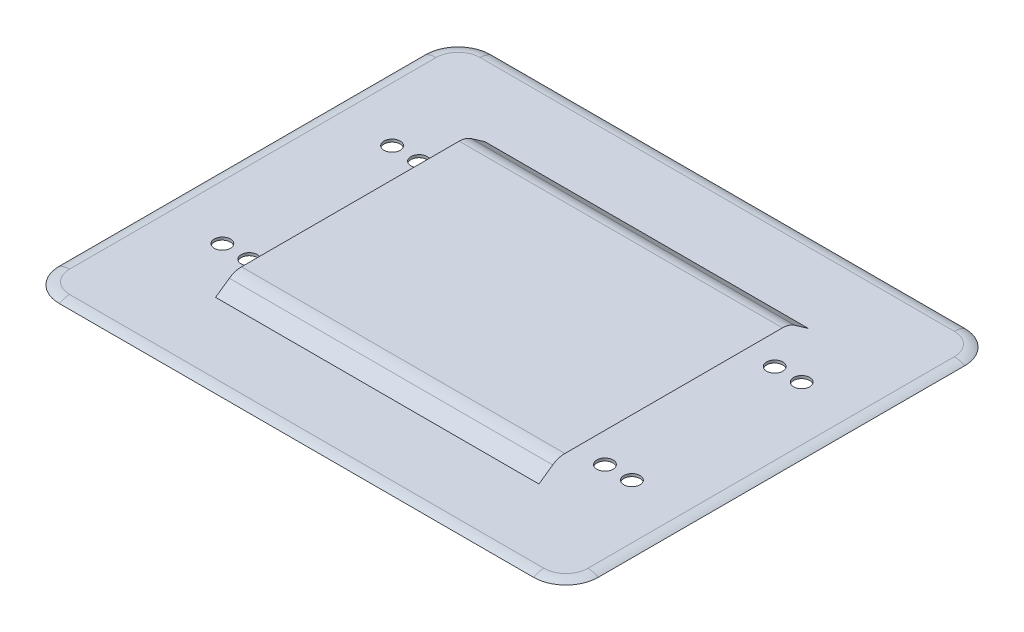
ISO-10303-21;
HEADER;
FILE_DESCRIPTION(('STEP AP214'),'2;1');
FILE_NAME('part.step','',(''),(''),'','','');
FILE_SCHEMA(('AUTOMOTIVE_DESIGN { 1 0 10303 214 1 1 1 1 }'));
ENDSEC;
DATA;
#1=APPLICATION_CONTEXT('core data for automotive mechanical design processes');
#2=APPLICATION_PROTOCOL_DEFINITION('international standard','automotive_design',2000,#1);
#3=PRODUCT_CONTEXT('',#1,'mechanical');
#4=PRODUCT('Part','Part','',(#3));
#5=PRODUCT_RELATED_PRODUCT_CATEGORY('part','',(#4));
#6=PRODUCT_DEFINITION_FORMATION('','',#4);
#7=PRODUCT_DEFINITION_CONTEXT('part definition',#1,'design');
#8=PRODUCT_DEFINITION('design','',#6,#7);
#9=PRODUCT_DEFINITION_SHAPE('','',#8);
#10=(LENGTH_UNIT() NAMED_UNIT(*) SI_UNIT(.MILLI.,.METRE.));
#11=(NAMED_UNIT(*) PLANE_ANGLE_UNIT() SI_UNIT($,.RADIAN.));
#12=(NAMED_UNIT(*) SI_UNIT($,.STERADIAN.) SOLID_ANGLE_UNIT());
#13=UNCERTAINTY_MEASURE_WITH_UNIT(LENGTH_MEASURE(1.E-05),#10,'distance_accuracy_value','');
#14=(GEOMETRIC_REPRESENTATION_CONTEXT(3) GLOBAL_UNCERTAINTY_ASSIGNED_CONTEXT((#13)) GLOBAL_UNIT_ASSIGNED_CONTEXT((#10,
#11,#12)) REPRESENTATION_CONTEXT('',''));
#15=CARTESIAN_POINT('',(0.,0.,0.));
#16=DIRECTION('',(0.,0.,1.));
#17=DIRECTION('',(1.,0.,0.));
#18=AXIS2_PLACEMENT_3D('',#15,#16,#17);
#19=CARTESIAN_POINT('',(76.2,1.27,63.5));
#20=DIRECTION('',(0.,0.819152044288991,0.573576436351047));
#21=DIRECTION('',(0.,-0.573576436351047,0.819152044288991));
#22=AXIS2_PLACEMENT_3D('',#19,#20,#21);
#23=PLANE('',#22);
#24=DIRECTION('',(0.,0.573576436351047,-0.819152044288991));
#25=VECTOR('',#24,1.);
#26=CARTESIAN_POINT('',(76.2,1.27,63.5));
#27=LINE('',#26,#25);
#28=CARTESIAN_POINT('',(76.2,1.27,63.5));
#29=VERTEX_POINT('',#28);
#30=CARTESIAN_POINT('',(76.2,5.81152044288991,57.0140366319082));
#31=VERTEX_POINT('',#30);
#32=EDGE_CURVE('E107',#29,#31,#27,.T.);
#33=ORIENTED_EDGE('',*,*,#32,.T.);
#34=DIRECTION('',(-1.,0.,0.));
#35=VECTOR('',#34,1.);
#36=CARTESIAN_POINT('',(76.2,5.81152044288991,57.0140366319082));
#37=LINE('',#36,#35);
#38=CARTESIAN_POINT('',(-76.2,5.81152044288991,57.0140366319082));
#39=VERTEX_POINT('',#38);
#40=EDGE_CURVE('E12',#31,#39,#37,.T.);
#41=ORIENTED_EDGE('',*,*,#40,.T.);
#42=DIRECTION('',(0.,0.573576436351047,-0.819152044288991));
#43=VECTOR('',#42,1.);
#44=CARTESIAN_POINT('',(-76.2,1.27,63.5));
#45=LINE('',#44,#43);
#46=CARTESIAN_POINT('',(-76.2,1.27,63.5));
#47=VERTEX_POINT('',#46);
#48=EDGE_CURVE('E108',#47,#39,#45,.T.);
#49=ORIENTED_EDGE('',*,*,#48,.F.);
#50=DIRECTION('',(-1.,0.,0.));
#51=VECTOR('',#50,1.);
#52=CARTESIAN_POINT('',(76.2,1.27,63.5));
#53=LINE('',#52,#51);
#54=EDGE_CURVE('E105',#29,#47,#53,.T.);
#55=ORIENTED_EDGE('',*,*,#54,.F.);
#56=EDGE_LOOP('',(#33,#41,#49,#55));
#57=FACE_BOUND('',#56,.T.);
#58=ADVANCED_FACE('F54',(#57),#23,.T.);
#59=CARTESIAN_POINT('',(76.2,7.62,54.4312601571876));
#60=DIRECTION('',(0.,1.,0.));
#61=DIRECTION('',(0.,0.,1.));
#62=AXIS2_PLACEMENT_3D('',#59,#60,#61);
#63=PLANE('',#62);
#64=DIRECTION('',(0.,0.,-1.));
#65=VECTOR('',#64,1.);
#66=CARTESIAN_POINT('',(76.2,7.62,54.4312601571876));
#67=LINE('',#66,#65);
#68=CARTESIAN_POINT('',(76.2,7.62,51.2782722683978));
#69=VERTEX_POINT('',#68);
#70=CARTESIAN_POINT('',(76.2,7.62,-51.2782722683978));
#71=VERTEX_POINT('',#70);
#72=EDGE_CURVE('E121',#69,#71,#67,.T.);
#73=ORIENTED_EDGE('',*,*,#72,.T.);
#74=DIRECTION('',(-1.,0.,0.));
#75=VECTOR('',#74,1.);
#76=CARTESIAN_POINT('',(76.2,7.62,-51.2782722683978));
#77=LINE('',#76,#75);
#78=CARTESIAN_POINT('',(-76.2,7.62,-51.2782722683978));
#79=VERTEX_POINT('',#78);
#80=EDGE_CURVE('E118',#71,#79,#77,.T.);
#81=ORIENTED_EDGE('',*,*,#80,.T.);
#82=DIRECTION('',(0.,0.,-1.));
#83=VECTOR('',#82,1.);
#84=CARTESIAN_POINT('',(-76.2,7.62,54.4312601571876));
#85=LINE('',#84,#83);
#86=CARTESIAN_POINT('',(-76.2,7.62,51.2782722683978));
#87=VERTEX_POINT('',#86);
#88=EDGE_CURVE('E124',#87,#79,#85,.T.);
#89=ORIENTED_EDGE('',*,*,#88,.F.);
#90=DIRECTION('',(-1.,0.,0.));
#91=VECTOR('',#90,1.);
#92=CARTESIAN_POINT('',(76.2,7.62,51.2782722683978));
#93=LINE('',#92,#91);
#94=EDGE_CURVE('E112',#87,#69,#93,.F.);
#95=ORIENTED_EDGE('',*,*,#94,.T.);
#96=EDGE_LOOP('',(#73,#81,#89,#95));
#97=FACE_BOUND('',#96,.T.);
#98=ADVANCED_FACE('F157',(#97),#63,.T.);
#99=CARTESIAN_POINT('',(76.2,7.62,-54.4312601571876));
#100=DIRECTION('',(0.,0.819152044288991,-0.573576436351047));
#101=DIRECTION('',(0.,0.573576436351047,0.819152044288991));
#102=AXIS2_PLACEMENT_3D('',#99,#100,#101);
#103=PLANE('',#102);
#104=DIRECTION('',(0.,-0.573576436351047,-0.819152044288991));
#105=VECTOR('',#104,1.);
#106=CARTESIAN_POINT('',(-76.2,7.62,-54.4312601571876));
#107=LINE('',#106,#105);
#108=CARTESIAN_POINT('',(-76.2,5.8115204428899,-57.0140366319082));
#109=VERTEX_POINT('',#108);
#110=CARTESIAN_POINT('',(-76.2,1.27,-63.5));
#111=VERTEX_POINT('',#110);
#112=EDGE_CURVE('E129',#109,#111,#107,.T.);
#113=ORIENTED_EDGE('',*,*,#112,.F.);
#114=DIRECTION('',(-1.,0.,0.));
#115=VECTOR('',#114,1.);
#116=CARTESIAN_POINT('',(76.2,5.8115204428899,-57.0140366319082));
#117=LINE('',#116,#115);
#118=CARTESIAN_POINT('',(76.2,5.8115204428899,-57.0140366319082));
#119=VERTEX_POINT('',#118);
#120=EDGE_CURVE('E61',#109,#119,#117,.F.);
#121=ORIENTED_EDGE('',*,*,#120,.T.);
#122=DIRECTION('',(0.,-0.573576436351047,-0.819152044288991));
#123=VECTOR('',#122,1.);
#124=CARTESIAN_POINT('',(76.2,7.62,-54.4312601571876));
#125=LINE('',#124,#123);
#126=CARTESIAN_POINT('',(76.2,1.27,-63.5));
#127=VERTEX_POINT('',#126);
#128=EDGE_CURVE('E125',#119,#127,#125,.T.);
#129=ORIENTED_EDGE('',*,*,#128,.T.);
#130=DIRECTION('',(-1.,0.,0.));
#131=VECTOR('',#130,1.);
#132=CARTESIAN_POINT('',(76.2,1.27,-63.5));
#133=LINE('',#132,#131);
#134=EDGE_CURVE('E128',#127,#111,#133,.T.);
#135=ORIENTED_EDGE('',*,*,#134,.T.);
#136=EDGE_LOOP('',(#113,#121,#129,#135));
#137=FACE_BOUND('',#136,.T.);
#138=ADVANCED_FACE('F165',(#137),#103,.T.);
#139=CARTESIAN_POINT('',(76.2,-2.38,-51.2782722683978));
#140=DIRECTION('',(-1.,0.,0.));
#141=DIRECTION('',(0.,0.,1.));
#142=AXIS2_PLACEMENT_3D('',#139,#140,#141);
#143=CYLINDRICAL_SURFACE('',#142,10.);
#144=CARTESIAN_POINT('',(76.2,-2.38,-51.2782722683978));
#145=DIRECTION('',(1.,0.,0.));
#146=DIRECTION('',(0.,0.,-1.));
#147=AXIS2_PLACEMENT_3D('',#144,#145,#146);
#148=CIRCLE('',#147,10.);
#149=EDGE_CURVE('E137',#71,#119,#148,.F.);
#150=ORIENTED_EDGE('',*,*,#149,.T.);
#151=ORIENTED_EDGE('',*,*,#120,.F.);
#152=CARTESIAN_POINT('',(-76.2,-2.38,-51.2782722683978));
#153=DIRECTION('',(-1.,0.,0.));
#154=DIRECTION('',(0.,0.,1.));
#155=AXIS2_PLACEMENT_3D('',#152,#153,#154);
#156=CIRCLE('',#155,10.);
#157=EDGE_CURVE('E144',#109,#79,#156,.F.);
#158=ORIENTED_EDGE('',*,*,#157,.T.);
#159=ORIENTED_EDGE('',*,*,#80,.F.);
#160=EDGE_LOOP('',(#150,#151,#158,#159));
#161=FACE_BOUND('',#160,.T.);
#162=ADVANCED_FACE('F160',(#161),#143,.T.);
#163=CARTESIAN_POINT('',(76.2,-2.38,51.2782722683978));
#164=DIRECTION('',(-1.,0.,0.));
#165=DIRECTION('',(0.,0.,1.));
#166=AXIS2_PLACEMENT_3D('',#163,#164,#165);
#167=CYLINDRICAL_SURFACE('',#166,10.);
#168=CARTESIAN_POINT('',(76.2,-2.38,51.2782722683978));
#169=DIRECTION('',(1.,0.,0.));
#170=DIRECTION('',(0.,0.,-1.));
#171=AXIS2_PLACEMENT_3D('',#168,#169,#170);
#172=CIRCLE('',#171,10.);
#173=EDGE_CURVE('E57',#31,#69,#172,.F.);
#174=ORIENTED_EDGE('',*,*,#173,.T.);
#175=ORIENTED_EDGE('',*,*,#94,.F.);
#176=CARTESIAN_POINT('',(-76.2,-2.38,51.2782722683978));
#177=DIRECTION('',(-1.,0.,0.));
#178=DIRECTION('',(0.,0.,1.));
#179=AXIS2_PLACEMENT_3D('',#176,#177,#178);
#180=CIRCLE('',#179,10.);
#181=EDGE_CURVE('E73',#87,#39,#180,.F.);
#182=ORIENTED_EDGE('',*,*,#181,.T.);
#183=ORIENTED_EDGE('',*,*,#40,.F.);
#184=EDGE_LOOP('',(#174,#175,#182,#183));
#185=FACE_BOUND('',#184,.T.);
#186=ADVANCED_FACE('F55',(#185),#167,.T.);
#187=OPEN_SHELL('',(#58,#98,#138,#162,#186));
#188=SHELL_BASED_SURFACE_MODEL('B2',(#187));
#189=CARTESIAN_POINT('',(111.76,1.27,86.36));
#190=DIRECTION('',(0.,1.,0.));
#191=DIRECTION('',(0.,0.,1.));
#192=AXIS2_PLACEMENT_3D('',#189,#190,#191);
#193=PLANE('',#192);
#194=CARTESIAN_POINT('',(96.5200000000001,1.27,40.005));
#195=DIRECTION('',(0.,1.,0.));
#196=DIRECTION('',(0.,0.,1.));
#197=AXIS2_PLACEMENT_3D('',#194,#195,#196);
#198=CIRCLE('',#197,3.81);
#199=CARTESIAN_POINT('',(96.5200000000001,1.27,43.815));
#200=VERTEX_POINT('',#199);
#201=EDGE_CURVE('E622',#200,#200,#198,.T.);
#202=ORIENTED_EDGE('',*,*,#201,.F.);
#203=EDGE_LOOP('',(#202));
#204=FACE_BOUND('',#203,.T.);
#205=CARTESIAN_POINT('',(83.8200000000001,1.27,-40.005));
#206=DIRECTION('',(0.,1.,0.));
#207=DIRECTION('',(0.,0.,1.));
#208=AXIS2_PLACEMENT_3D('',#205,#206,#207);
#209=CIRCLE('',#208,3.81);
#210=CARTESIAN_POINT('',(83.8200000000001,1.27,-36.195));
#211=VERTEX_POINT('',#210);
#212=EDGE_CURVE('E631',#211,#211,#209,.T.);
#213=ORIENTED_EDGE('',*,*,#212,.F.);
#214=EDGE_LOOP('',(#213));
#215=FACE_BOUND('',#214,.T.);
#216=CARTESIAN_POINT('',(83.8200000000001,1.27,40.005));
#217=DIRECTION('',(0.,1.,0.));
#218=DIRECTION('',(0.,0.,1.));
#219=AXIS2_PLACEMENT_3D('',#216,#217,#218);
#220=CIRCLE('',#219,3.81);
#221=CARTESIAN_POINT('',(83.8200000000001,1.27,43.815));
#222=VERTEX_POINT('',#221);
#223=EDGE_CURVE('E704',#222,#222,#220,.T.);
#224=ORIENTED_EDGE('',*,*,#223,.F.);
#225=EDGE_LOOP('',(#224));
#226=FACE_BOUND('',#225,.T.);
#227=CARTESIAN_POINT('',(96.5200000000001,1.27,-40.005));
#228=DIRECTION('',(0.,1.,0.));
#229=DIRECTION('',(0.,0.,1.));
#230=AXIS2_PLACEMENT_3D('',#227,#228,#229);
#231=CIRCLE('',#230,3.81);
#232=CARTESIAN_POINT('',(96.5200000000001,1.27,-36.195));
#233=VERTEX_POINT('',#232);
#234=EDGE_CURVE('E628',#233,#233,#231,.T.);
#235=ORIENTED_EDGE('',*,*,#234,.F.);
#236=EDGE_LOOP('',(#235));
#237=FACE_BOUND('',#236,.T.);
#238=CARTESIAN_POINT('',(-83.82,1.27,40.005));
#239=DIRECTION('',(0.,1.,0.));
#240=DIRECTION('',(0.,0.,1.));
#241=AXIS2_PLACEMENT_3D('',#238,#239,#240);
#242=CIRCLE('',#241,3.81);
#243=CARTESIAN_POINT('',(-83.82,1.27,43.815));
#244=VERTEX_POINT('',#243);
#245=EDGE_CURVE('E647',#244,#244,#242,.T.);
#246=ORIENTED_EDGE('',*,*,#245,.F.);
#247=EDGE_LOOP('',(#246));
#248=FACE_BOUND('',#247,.T.);
#249=CARTESIAN_POINT('',(-96.52,1.27,-40.005));
#250=DIRECTION('',(0.,1.,0.));
#251=DIRECTION('',(0.,0.,1.));
#252=AXIS2_PLACEMENT_3D('',#249,#250,#251);
#253=CIRCLE('',#252,3.81);
#254=CARTESIAN_POINT('',(-96.52,1.27,-36.195));
#255=VERTEX_POINT('',#254);
#256=EDGE_CURVE('E658',#255,#255,#253,.T.);
#257=ORIENTED_EDGE('',*,*,#256,.F.);
#258=EDGE_LOOP('',(#257));
#259=FACE_BOUND('',#258,.T.);
#260=CARTESIAN_POINT('',(-96.52,1.27,40.005));
#261=DIRECTION('',(0.,1.,0.));
#262=DIRECTION('',(0.,0.,1.));
#263=AXIS2_PLACEMENT_3D('',#260,#261,#262);
#264=CIRCLE('',#263,3.81);
#265=CARTESIAN_POINT('',(-96.52,1.27,43.815));
#266=VERTEX_POINT('',#265);
#267=EDGE_CURVE('E648',#266,#266,#264,.T.);
#268=ORIENTED_EDGE('',*,*,#267,.F.);
#269=EDGE_LOOP('',(#268));
#270=FACE_BOUND('',#269,.T.);
#271=CARTESIAN_POINT('',(-83.82,1.27,-40.005));
#272=DIRECTION('',(0.,1.,0.));
#273=DIRECTION('',(0.,0.,1.));
#274=AXIS2_PLACEMENT_3D('',#271,#272,#273);
#275=CIRCLE('',#274,3.81);
#276=CARTESIAN_POINT('',(-83.82,1.27,-36.195));
#277=VERTEX_POINT('',#276);
#278=EDGE_CURVE('E657',#277,#277,#275,.T.);
#279=ORIENTED_EDGE('',*,*,#278,.F.);
#280=EDGE_LOOP('',(#279));
#281=FACE_BOUND('',#280,.T.);
#282=DIRECTION('',(0.,0.,-1.));
#283=VECTOR('',#282,1.);
#284=CARTESIAN_POINT('',(-122.122797933241,1.27,86.3599999999999));
#285=LINE('',#284,#283);
#286=CARTESIAN_POINT('',(-122.122797933241,1.27,-86.3599999999999));
#287=VERTEX_POINT('',#286);
#288=CARTESIAN_POINT('',(-122.122797933241,1.27,86.3599999999999));
#289=VERTEX_POINT('',#288);
#290=EDGE_CURVE('E235',#287,#289,#285,.F.);
#291=ORIENTED_EDGE('',*,*,#290,.T.);
#292=CARTESIAN_POINT('',(-111.76,1.27,86.36));
#293=DIRECTION('',(0.,1.,0.));
#294=DIRECTION('',(0.,0.,1.));
#295=AXIS2_PLACEMENT_3D('',#292,#293,#294);
#296=CIRCLE('',#295,10.3627979332408);
#297=CARTESIAN_POINT('',(-111.76,1.27,96.7227979332408));
#298=VERTEX_POINT('',#297);
#299=EDGE_CURVE('E52',#289,#298,#296,.T.);
#300=ORIENTED_EDGE('',*,*,#299,.T.);
#301=DIRECTION('',(-1.,0.,0.));
#302=VECTOR('',#301,1.);
#303=CARTESIAN_POINT('',(111.76,1.27,96.7227979332408));
#304=LINE('',#303,#302);
#305=CARTESIAN_POINT('',(111.76,1.27,96.7227979332408));
#306=VERTEX_POINT('',#305);
#307=EDGE_CURVE('E348',#298,#306,#304,.F.);
#308=ORIENTED_EDGE('',*,*,#307,.T.);
#309=CARTESIAN_POINT('',(111.76,1.27,86.36));
#310=DIRECTION('',(0.,1.,0.));
#311=DIRECTION('',(0.,0.,1.));
#312=AXIS2_PLACEMENT_3D('',#309,#310,#311);
#313=CIRCLE('',#312,10.3627979332408);
#314=CARTESIAN_POINT('',(122.122797933241,1.27,86.3599999999999));
#315=VERTEX_POINT('',#314);
#316=EDGE_CURVE('E351',#306,#315,#313,.T.);
#317=ORIENTED_EDGE('',*,*,#316,.T.);
#318=DIRECTION('',(0.,0.,1.));
#319=VECTOR('',#318,1.);
#320=CARTESIAN_POINT('',(122.122797933241,1.27,-86.3599999999999));
#321=LINE('',#320,#319);
#322=CARTESIAN_POINT('',(122.122797933241,1.27,-86.3599999999999));
#323=VERTEX_POINT('',#322);
#324=EDGE_CURVE('E307',#315,#323,#321,.F.);
#325=ORIENTED_EDGE('',*,*,#324,.T.);
#326=CARTESIAN_POINT('',(111.76,1.27,-86.36));
#327=DIRECTION('',(0.,1.,0.));
#328=DIRECTION('',(0.,0.,1.));
#329=AXIS2_PLACEMENT_3D('',#326,#327,#328);
#330=CIRCLE('',#329,10.3627979332408);
#331=CARTESIAN_POINT('',(111.76,1.27,-96.7227979332408));
#332=VERTEX_POINT('',#331);
#333=EDGE_CURVE('E356',#323,#332,#330,.T.);
#334=ORIENTED_EDGE('',*,*,#333,.T.);
#335=DIRECTION('',(1.,0.,0.));
#336=VECTOR('',#335,1.);
#337=CARTESIAN_POINT('',(-111.76,1.27,-96.7227979332408));
#338=LINE('',#337,#336);
#339=CARTESIAN_POINT('',(-111.76,1.27,-96.7227979332408));
#340=VERTEX_POINT('',#339);
#341=EDGE_CURVE('E359',#332,#340,#338,.F.);
#342=ORIENTED_EDGE('',*,*,#341,.T.);
#343=CARTESIAN_POINT('',(-111.76,1.27,-86.36));
#344=DIRECTION('',(0.,1.,0.));
#345=DIRECTION('',(0.,0.,1.));
#346=AXIS2_PLACEMENT_3D('',#343,#344,#345);
#347=CIRCLE('',#346,10.3627979332408);
#348=EDGE_CURVE('E246',#340,#287,#347,.T.);
#349=ORIENTED_EDGE('',*,*,#348,.T.);
#350=EDGE_LOOP('',(#291,#300,#308,#317,#325,#334,#342,#349));
#351=FACE_BOUND('',#350,.T.);
#352=ADVANCED_FACE('F225',(#204,#215,#226,#237,#248,#259,#270,#281,#351),#193,.T.);
#353=CARTESIAN_POINT('',(111.76,0.,86.36));
#354=DIRECTION('',(0.,1.,0.));
#355=DIRECTION('',(0.,0.,1.));
#356=AXIS2_PLACEMENT_3D('',#353,#354,#355);
#357=PLANE('',#356);
#358=CARTESIAN_POINT('',(96.5200000000001,0.,40.005));
#359=DIRECTION('',(0.,1.,0.));
#360=DIRECTION('',(0.,0.,1.));
#361=AXIS2_PLACEMENT_3D('',#358,#359,#360);
#362=CIRCLE('',#361,3.81);
#363=CARTESIAN_POINT('',(96.5200000000001,0.,43.815));
#364=VERTEX_POINT('',#363);
#365=EDGE_CURVE('E620',#364,#364,#362,.F.);
#366=ORIENTED_EDGE('',*,*,#365,.F.);
#367=EDGE_LOOP('',(#366));
#368=FACE_BOUND('',#367,.T.);
#369=CARTESIAN_POINT('',(83.8200000000001,0.,-40.005));
#370=DIRECTION('',(0.,1.,0.));
#371=DIRECTION('',(0.,0.,1.));
#372=AXIS2_PLACEMENT_3D('',#369,#370,#371);
#373=CIRCLE('',#372,3.81);
#374=CARTESIAN_POINT('',(83.8200000000001,0.,-36.195));
#375=VERTEX_POINT('',#374);
#376=EDGE_CURVE('E624',#375,#375,#373,.F.);
#377=ORIENTED_EDGE('',*,*,#376,.F.);
#378=EDGE_LOOP('',(#377));
#379=FACE_BOUND('',#378,.T.);
#380=CARTESIAN_POINT('',(83.8200000000001,0.,40.005));
#381=DIRECTION('',(0.,1.,0.));
#382=DIRECTION('',(0.,0.,1.));
#383=AXIS2_PLACEMENT_3D('',#380,#381,#382);
#384=CIRCLE('',#383,3.81);
#385=CARTESIAN_POINT('',(83.8200000000001,0.,43.815));
#386=VERTEX_POINT('',#385);
#387=EDGE_CURVE('E634',#386,#386,#384,.F.);
#388=ORIENTED_EDGE('',*,*,#387,.F.);
#389=EDGE_LOOP('',(#388));
#390=FACE_BOUND('',#389,.T.);
#391=CARTESIAN_POINT('',(96.5200000000001,0.,-40.005));
#392=DIRECTION('',(0.,1.,0.));
#393=DIRECTION('',(0.,0.,1.));
#394=AXIS2_PLACEMENT_3D('',#391,#392,#393);
#395=CIRCLE('',#394,3.81);
#396=CARTESIAN_POINT('',(96.5200000000001,0.,-36.195));
#397=VERTEX_POINT('',#396);
#398=EDGE_CURVE('E643',#397,#397,#395,.F.);
#399=ORIENTED_EDGE('',*,*,#398,.F.);
#400=EDGE_LOOP('',(#399));
#401=FACE_BOUND('',#400,.T.);
#402=CARTESIAN_POINT('',(-83.82,0.,40.005));
#403=DIRECTION('',(0.,1.,0.));
#404=DIRECTION('',(0.,0.,1.));
#405=AXIS2_PLACEMENT_3D('',#402,#403,#404);
#406=CIRCLE('',#405,3.81);
#407=CARTESIAN_POINT('',(-83.82,0.,43.815));
#408=VERTEX_POINT('',#407);
#409=EDGE_CURVE('E662',#408,#408,#406,.F.);
#410=ORIENTED_EDGE('',*,*,#409,.F.);
#411=EDGE_LOOP('',(#410));
#412=FACE_BOUND('',#411,.T.);
#413=CARTESIAN_POINT('',(-96.52,0.,-40.005));
#414=DIRECTION('',(0.,1.,0.));
#415=DIRECTION('',(0.,0.,1.));
#416=AXIS2_PLACEMENT_3D('',#413,#414,#415);
#417=CIRCLE('',#416,3.81);
#418=CARTESIAN_POINT('',(-96.52,0.,-36.195));
#419=VERTEX_POINT('',#418);
#420=EDGE_CURVE('E653',#419,#419,#417,.F.);
#421=ORIENTED_EDGE('',*,*,#420,.F.);
#422=EDGE_LOOP('',(#421));
#423=FACE_BOUND('',#422,.T.);
#424=CARTESIAN_POINT('',(-96.52,0.,40.005));
#425=DIRECTION('',(0.,1.,0.));
#426=DIRECTION('',(0.,0.,1.));
#427=AXIS2_PLACEMENT_3D('',#424,#425,#426);
#428=CIRCLE('',#427,3.81);
#429=CARTESIAN_POINT('',(-96.52,0.,43.815));
#430=VERTEX_POINT('',#429);
#431=EDGE_CURVE('E652',#430,#430,#428,.F.);
#432=ORIENTED_EDGE('',*,*,#431,.F.);
#433=EDGE_LOOP('',(#432));
#434=FACE_BOUND('',#433,.T.);
#435=CARTESIAN_POINT('',(-83.82,0.,-40.005));
#436=DIRECTION('',(0.,1.,0.));
#437=DIRECTION('',(0.,0.,1.));
#438=AXIS2_PLACEMENT_3D('',#435,#436,#437);
#439=CIRCLE('',#438,3.81);
#440=CARTESIAN_POINT('',(-83.82,0.,-36.195));
#441=VERTEX_POINT('',#440);
#442=EDGE_CURVE('E324',#441,#441,#439,.F.);
#443=ORIENTED_EDGE('',*,*,#442,.F.);
#444=EDGE_LOOP('',(#443));
#445=FACE_BOUND('',#444,.T.);
#446=CARTESIAN_POINT('',(111.76,0.,86.36));
#447=DIRECTION('',(0.,1.,0.));
#448=DIRECTION('',(0.,0.,1.));
#449=AXIS2_PLACEMENT_3D('',#446,#447,#448);
#450=CIRCLE('',#449,15.24);
#451=CARTESIAN_POINT('',(111.76,0.,101.6));
#452=VERTEX_POINT('',#451);
#453=CARTESIAN_POINT('',(127.,0.,86.3599999999999));
#454=VERTEX_POINT('',#453);
#455=EDGE_CURVE('E294',#452,#454,#450,.T.);
#456=ORIENTED_EDGE('',*,*,#455,.F.);
#457=DIRECTION('',(1.,0.,0.));
#458=VECTOR('',#457,1.);
#459=CARTESIAN_POINT('',(-111.76,0.,101.6));
#460=LINE('',#459,#458);
#461=CARTESIAN_POINT('',(-111.76,0.,101.6));
#462=VERTEX_POINT('',#461);
#463=EDGE_CURVE('E345',#462,#452,#460,.T.);
#464=ORIENTED_EDGE('',*,*,#463,.F.);
#465=CARTESIAN_POINT('',(-111.76,0.,86.36));
#466=DIRECTION('',(0.,1.,0.));
#467=DIRECTION('',(0.,0.,1.));
#468=AXIS2_PLACEMENT_3D('',#465,#466,#467);
#469=CIRCLE('',#468,15.24);
#470=CARTESIAN_POINT('',(-127.,0.,86.3599999999999));
#471=VERTEX_POINT('',#470);
#472=EDGE_CURVE('E341',#471,#462,#469,.T.);
#473=ORIENTED_EDGE('',*,*,#472,.F.);
#474=DIRECTION('',(0.,0.,1.));
#475=VECTOR('',#474,1.);
#476=CARTESIAN_POINT('',(-127.,0.,-86.3599999999999));
#477=LINE('',#476,#475);
#478=CARTESIAN_POINT('',(-127.,0.,-86.3599999999999));
#479=VERTEX_POINT('',#478);
#480=EDGE_CURVE('E337',#479,#471,#477,.T.);
#481=ORIENTED_EDGE('',*,*,#480,.F.);
#482=CARTESIAN_POINT('',(-111.76,0.,-86.36));
#483=DIRECTION('',(0.,1.,0.));
#484=DIRECTION('',(0.,0.,-1.));
#485=AXIS2_PLACEMENT_3D('',#482,#483,#484);
#486=CIRCLE('',#485,15.24);
#487=CARTESIAN_POINT('',(-111.76,0.,-101.6));
#488=VERTEX_POINT('',#487);
#489=EDGE_CURVE('E333',#488,#479,#486,.T.);
#490=ORIENTED_EDGE('',*,*,#489,.F.);
#491=DIRECTION('',(-1.,0.,0.));
#492=VECTOR('',#491,1.);
#493=CARTESIAN_POINT('',(111.76,0.,-101.6));
#494=LINE('',#493,#492);
#495=CARTESIAN_POINT('',(111.76,0.,-101.6));
#496=VERTEX_POINT('',#495);
#497=EDGE_CURVE('E329',#496,#488,#494,.T.);
#498=ORIENTED_EDGE('',*,*,#497,.F.);
#499=CARTESIAN_POINT('',(111.76,0.,-86.36));
#500=DIRECTION('',(0.,1.,0.));
#501=DIRECTION('',(0.,0.,1.));
#502=AXIS2_PLACEMENT_3D('',#499,#500,#501);
#503=CIRCLE('',#502,15.24);
#504=CARTESIAN_POINT('',(127.,0.,-86.3599999999999));
#505=VERTEX_POINT('',#504);
#506=EDGE_CURVE('E297',#505,#496,#503,.T.);
#507=ORIENTED_EDGE('',*,*,#506,.F.);
#508=DIRECTION('',(0.,0.,-1.));
#509=VECTOR('',#508,1.);
#510=CARTESIAN_POINT('',(127.,0.,86.3599999999999));
#511=LINE('',#510,#509);
#512=EDGE_CURVE('E290',#454,#505,#511,.T.);
#513=ORIENTED_EDGE('',*,*,#512,.F.);
#514=EDGE_LOOP('',(#456,#464,#473,#481,#490,#498,#507,#513));
#515=FACE_BOUND('',#514,.T.);
#516=ADVANCED_FACE('F292',(#368,#379,#390,#401,#412,#423,#434,#445,#515),#357,.F.);
#517=CARTESIAN_POINT('',(111.76,-8.73,-86.36));
#518=DIRECTION('',(0.,-1.,0.));
#519=DIRECTION('',(0.,0.,-1.));
#520=AXIS2_PLACEMENT_3D('',#517,#518,#519);
#521=TOROIDAL_SURFACE('',#520,10.3627979332408,10.);
#522=CARTESIAN_POINT('',(122.122797933241,-8.73,-86.36));
#523=DIRECTION('',(0.,0.,1.));
#524=DIRECTION('',(1.,0.,0.));
#525=AXIS2_PLACEMENT_3D('',#522,#523,#524);
#526=CIRCLE('',#525,10.);
#527=EDGE_CURVE('E322',#505,#323,#526,.T.);
#528=ORIENTED_EDGE('',*,*,#527,.F.);
#529=ORIENTED_EDGE('',*,*,#506,.T.);
#530=CARTESIAN_POINT('',(111.76,-8.73,-96.7227979332408));
#531=DIRECTION('',(-1.,0.,0.));
#532=DIRECTION('',(0.,0.,1.));
#533=AXIS2_PLACEMENT_3D('',#530,#531,#532);
#534=CIRCLE('',#533,10.);
#535=EDGE_CURVE('E229',#332,#496,#534,.T.);
#536=ORIENTED_EDGE('',*,*,#535,.F.);
#537=ORIENTED_EDGE('',*,*,#333,.F.);
#538=EDGE_LOOP('',(#528,#529,#536,#537));
#539=FACE_BOUND('',#538,.T.);
#540=ADVANCED_FACE('F227',(#539),#521,.T.);
#541=CARTESIAN_POINT('',(111.76,-8.73,-96.7227979332408));
#542=DIRECTION('',(-1.,0.,0.));
#543=DIRECTION('',(0.,0.,1.));
#544=AXIS2_PLACEMENT_3D('',#541,#542,#543);
#545=CYLINDRICAL_SURFACE('',#544,10.);
#546=ORIENTED_EDGE('',*,*,#535,.T.);
#547=ORIENTED_EDGE('',*,*,#497,.T.);
#548=CARTESIAN_POINT('',(-111.76,-8.73,-96.7227979332408));
#549=DIRECTION('',(-1.,0.,0.));
#550=DIRECTION('',(0.,0.,1.));
#551=AXIS2_PLACEMENT_3D('',#548,#549,#550);
#552=CIRCLE('',#551,10.);
#553=EDGE_CURVE('E311',#340,#488,#552,.T.);
#554=ORIENTED_EDGE('',*,*,#553,.F.);
#555=ORIENTED_EDGE('',*,*,#341,.F.);
#556=EDGE_LOOP('',(#546,#547,#554,#555));
#557=FACE_BOUND('',#556,.T.);
#558=ADVANCED_FACE('F398',(#557),#545,.T.);
#559=CARTESIAN_POINT('',(122.122797933241,-8.73,86.3599999999999));
#560=DIRECTION('',(0.,0.,-1.));
#561=DIRECTION('',(-1.,0.,0.));
#562=AXIS2_PLACEMENT_3D('',#559,#560,#561);
#563=CYLINDRICAL_SURFACE('',#562,10.);
#564=ORIENTED_EDGE('',*,*,#527,.T.);
#565=ORIENTED_EDGE('',*,*,#324,.F.);
#566=CARTESIAN_POINT('',(122.122797933241,-8.73,86.3599999999999));
#567=DIRECTION('',(0.,0.,1.));
#568=DIRECTION('',(1.,0.,0.));
#569=AXIS2_PLACEMENT_3D('',#566,#567,#568);
#570=CIRCLE('',#569,10.);
#571=EDGE_CURVE('E305',#454,#315,#570,.T.);
#572=ORIENTED_EDGE('',*,*,#571,.F.);
#573=ORIENTED_EDGE('',*,*,#512,.T.);
#574=EDGE_LOOP('',(#564,#565,#572,#573));
#575=FACE_BOUND('',#574,.T.);
#576=ADVANCED_FACE('F306',(#575),#563,.T.);
#577=CARTESIAN_POINT('',(-111.76,-8.73,-86.36));
#578=DIRECTION('',(0.,-1.,0.));
#579=DIRECTION('',(0.,0.,-1.));
#580=AXIS2_PLACEMENT_3D('',#577,#578,#579);
#581=TOROIDAL_SURFACE('',#580,10.3627979332408,10.);
#582=ORIENTED_EDGE('',*,*,#553,.T.);
#583=ORIENTED_EDGE('',*,*,#489,.T.);
#584=CARTESIAN_POINT('',(-122.122797933241,-8.73,-86.3599999999999));
#585=DIRECTION('',(0.,0.,1.));
#586=DIRECTION('',(1.,0.,0.));
#587=AXIS2_PLACEMENT_3D('',#584,#585,#586);
#588=CIRCLE('',#587,10.);
#589=EDGE_CURVE('E312',#287,#479,#588,.T.);
#590=ORIENTED_EDGE('',*,*,#589,.F.);
#591=ORIENTED_EDGE('',*,*,#348,.F.);
#592=EDGE_LOOP('',(#582,#583,#590,#591));
#593=FACE_BOUND('',#592,.T.);
#594=ADVANCED_FACE('F396',(#593),#581,.T.);
#595=CARTESIAN_POINT('',(111.76,-8.73,86.36));
#596=DIRECTION('',(0.,-1.,0.));
#597=DIRECTION('',(0.,0.,-1.));
#598=AXIS2_PLACEMENT_3D('',#595,#596,#597);
#599=TOROIDAL_SURFACE('',#598,10.3627979332408,10.);
#600=ORIENTED_EDGE('',*,*,#571,.T.);
#601=ORIENTED_EDGE('',*,*,#316,.F.);
#602=CARTESIAN_POINT('',(111.76,-8.73,96.7227979332408));
#603=DIRECTION('',(-1.,0.,0.));
#604=DIRECTION('',(0.,0.,1.));
#605=AXIS2_PLACEMENT_3D('',#602,#603,#604);
#606=CIRCLE('',#605,10.);
#607=EDGE_CURVE('E316',#452,#306,#606,.T.);
#608=ORIENTED_EDGE('',*,*,#607,.F.);
#609=ORIENTED_EDGE('',*,*,#455,.T.);
#610=EDGE_LOOP('',(#600,#601,#608,#609));
#611=FACE_BOUND('',#610,.T.);
#612=ADVANCED_FACE('F314',(#611),#599,.T.);
#613=CARTESIAN_POINT('',(-122.122797933241,-8.73,-86.3599999999999));
#614=DIRECTION('',(0.,0.,1.));
#615=DIRECTION('',(1.,0.,0.));
#616=AXIS2_PLACEMENT_3D('',#613,#614,#615);
#617=CYLINDRICAL_SURFACE('',#616,10.);
#618=ORIENTED_EDGE('',*,*,#589,.T.);
#619=ORIENTED_EDGE('',*,*,#480,.T.);
#620=CARTESIAN_POINT('',(-122.122797933241,-8.73,86.3599999999999));
#621=DIRECTION('',(0.,0.,1.));
#622=DIRECTION('',(1.,0.,0.));
#623=AXIS2_PLACEMENT_3D('',#620,#621,#622);
#624=CIRCLE('',#623,10.);
#625=EDGE_CURVE('E369',#289,#471,#624,.T.);
#626=ORIENTED_EDGE('',*,*,#625,.F.);
#627=ORIENTED_EDGE('',*,*,#290,.F.);
#628=EDGE_LOOP('',(#618,#619,#626,#627));
#629=FACE_BOUND('',#628,.T.);
#630=ADVANCED_FACE('F394',(#629),#617,.T.);
#631=CARTESIAN_POINT('',(-111.76,-8.73,96.7227979332408));
#632=DIRECTION('',(1.,0.,0.));
#633=DIRECTION('',(0.,0.,-1.));
#634=AXIS2_PLACEMENT_3D('',#631,#632,#633);
#635=CYLINDRICAL_SURFACE('',#634,10.);
#636=ORIENTED_EDGE('',*,*,#607,.T.);
#637=ORIENTED_EDGE('',*,*,#307,.F.);
#638=CARTESIAN_POINT('',(-111.76,-8.73,96.7227979332408));
#639=DIRECTION('',(-1.,0.,0.));
#640=DIRECTION('',(0.,0.,1.));
#641=AXIS2_PLACEMENT_3D('',#638,#639,#640);
#642=CIRCLE('',#641,10.);
#643=EDGE_CURVE('E366',#462,#298,#642,.T.);
#644=ORIENTED_EDGE('',*,*,#643,.F.);
#645=ORIENTED_EDGE('',*,*,#463,.T.);
#646=EDGE_LOOP('',(#636,#637,#644,#645));
#647=FACE_BOUND('',#646,.T.);
#648=ADVANCED_FACE('F387',(#647),#635,.T.);
#649=CARTESIAN_POINT('',(-111.76,-8.73,86.36));
#650=DIRECTION('',(0.,-1.,0.));
#651=DIRECTION('',(0.,0.,-1.));
#652=AXIS2_PLACEMENT_3D('',#649,#650,#651);
#653=TOROIDAL_SURFACE('',#652,10.3627979332408,10.);
#654=ORIENTED_EDGE('',*,*,#625,.T.);
#655=ORIENTED_EDGE('',*,*,#472,.T.);
#656=ORIENTED_EDGE('',*,*,#643,.T.);
#657=ORIENTED_EDGE('',*,*,#299,.F.);
#658=EDGE_LOOP('',(#654,#655,#656,#657));
#659=FACE_BOUND('',#658,.T.);
#660=ADVANCED_FACE('F391',(#659),#653,.T.);
#661=CARTESIAN_POINT('',(-83.82,-10.776307345283,-40.005));
#662=DIRECTION('',(0.,1.,0.));
#663=DIRECTION('',(0.,0.,1.));
#664=AXIS2_PLACEMENT_3D('',#661,#662,#663);
#665=CYLINDRICAL_SURFACE('',#664,3.81);
#666=ORIENTED_EDGE('',*,*,#442,.T.);
#667=EDGE_LOOP('',(#666));
#668=FACE_BOUND('',#667,.T.);
#669=ORIENTED_EDGE('',*,*,#278,.T.);
#670=EDGE_LOOP('',(#669));
#671=FACE_BOUND('',#670,.T.);
#672=ADVANCED_FACE('F418',(#668,#671),#665,.F.);
#673=CARTESIAN_POINT('',(-96.52,-10.776307345283,40.005));
#674=DIRECTION('',(0.,1.,0.));
#675=DIRECTION('',(0.,0.,1.));
#676=AXIS2_PLACEMENT_3D('',#673,#674,#675);
#677=CYLINDRICAL_SURFACE('',#676,3.81);
#678=ORIENTED_EDGE('',*,*,#431,.T.);
#679=EDGE_LOOP('',(#678));
#680=FACE_BOUND('',#679,.T.);
#681=ORIENTED_EDGE('',*,*,#267,.T.);
#682=EDGE_LOOP('',(#681));
#683=FACE_BOUND('',#682,.T.);
#684=ADVANCED_FACE('F457',(#680,#683),#677,.F.);
#685=CARTESIAN_POINT('',(-96.52,-10.776307345283,-40.005));
#686=DIRECTION('',(0.,1.,0.));
#687=DIRECTION('',(0.,0.,1.));
#688=AXIS2_PLACEMENT_3D('',#685,#686,#687);
#689=CYLINDRICAL_SURFACE('',#688,3.81);
#690=ORIENTED_EDGE('',*,*,#420,.T.);
#691=EDGE_LOOP('',(#690));
#692=FACE_BOUND('',#691,.T.);
#693=ORIENTED_EDGE('',*,*,#256,.T.);
#694=EDGE_LOOP('',(#693));
#695=FACE_BOUND('',#694,.T.);
#696=ADVANCED_FACE('F465',(#692,#695),#689,.F.);
#697=CARTESIAN_POINT('',(-83.82,-10.776307345283,40.005));
#698=DIRECTION('',(0.,1.,0.));
#699=DIRECTION('',(0.,0.,1.));
#700=AXIS2_PLACEMENT_3D('',#697,#698,#699);
#701=CYLINDRICAL_SURFACE('',#700,3.81);
#702=ORIENTED_EDGE('',*,*,#409,.T.);
#703=EDGE_LOOP('',(#702));
#704=FACE_BOUND('',#703,.T.);
#705=ORIENTED_EDGE('',*,*,#245,.T.);
#706=EDGE_LOOP('',(#705));
#707=FACE_BOUND('',#706,.T.);
#708=ADVANCED_FACE('F473',(#704,#707),#701,.F.);
#709=CARTESIAN_POINT('',(96.5200000000001,-10.776307345283,-40.005));
#710=DIRECTION('',(0.,1.,0.));
#711=DIRECTION('',(0.,0.,1.));
#712=AXIS2_PLACEMENT_3D('',#709,#710,#711);
#713=CYLINDRICAL_SURFACE('',#712,3.81);
#714=ORIENTED_EDGE('',*,*,#398,.T.);
#715=EDGE_LOOP('',(#714));
#716=FACE_BOUND('',#715,.T.);
#717=ORIENTED_EDGE('',*,*,#234,.T.);
#718=EDGE_LOOP('',(#717));
#719=FACE_BOUND('',#718,.T.);
#720=ADVANCED_FACE('F481',(#716,#719),#713,.F.);
#721=CARTESIAN_POINT('',(83.8200000000001,-10.776307345283,40.005));
#722=DIRECTION('',(0.,1.,0.));
#723=DIRECTION('',(0.,0.,1.));
#724=AXIS2_PLACEMENT_3D('',#721,#722,#723);
#725=CYLINDRICAL_SURFACE('',#724,3.81);
#726=ORIENTED_EDGE('',*,*,#387,.T.);
#727=EDGE_LOOP('',(#726));
#728=FACE_BOUND('',#727,.T.);
#729=ORIENTED_EDGE('',*,*,#223,.T.);
#730=EDGE_LOOP('',(#729));
#731=FACE_BOUND('',#730,.T.);
#732=ADVANCED_FACE('F489',(#728,#731),#725,.F.);
#733=CARTESIAN_POINT('',(83.8200000000001,-10.776307345283,-40.005));
#734=DIRECTION('',(0.,1.,0.));
#735=DIRECTION('',(0.,0.,1.));
#736=AXIS2_PLACEMENT_3D('',#733,#734,#735);
#737=CYLINDRICAL_SURFACE('',#736,3.81);
#738=ORIENTED_EDGE('',*,*,#376,.T.);
#739=EDGE_LOOP('',(#738));
#740=FACE_BOUND('',#739,.T.);
#741=ORIENTED_EDGE('',*,*,#212,.T.);
#742=EDGE_LOOP('',(#741));
#743=FACE_BOUND('',#742,.T.);
#744=ADVANCED_FACE('F498',(#740,#743),#737,.F.);
#745=CARTESIAN_POINT('',(96.5200000000001,-10.776307345283,40.005));
#746=DIRECTION('',(0.,1.,0.));
#747=DIRECTION('',(0.,0.,1.));
#748=AXIS2_PLACEMENT_3D('',#745,#746,#747);
#749=CYLINDRICAL_SURFACE('',#748,3.81);
#750=ORIENTED_EDGE('',*,*,#365,.T.);
#751=EDGE_LOOP('',(#750));
#752=FACE_BOUND('',#751,.T.);
#753=ORIENTED_EDGE('',*,*,#201,.T.);
#754=EDGE_LOOP('',(#753));
#755=FACE_BOUND('',#754,.T.);
#756=ADVANCED_FACE('F506',(#752,#755),#749,.F.);
#757=CLOSED_SHELL('',(#352,#516,#540,#558,#576,#594,#612,#630,#648,#660,#672,#684,#696,#708,
#720,#732,#744,#756));
#758=MANIFOLD_SOLID_BREP('B6',#757);
#759=ADVANCED_BREP_SHAPE_REPRESENTATION('',(#18,#758),#14);
#760=MANIFOLD_SURFACE_SHAPE_REPRESENTATION('',(#18,#188),#14);
#761=SHAPE_REPRESENTATION('',(#18),#14);
#762=SHAPE_DEFINITION_REPRESENTATION(#9,#761);
#763=SHAPE_REPRESENTATION_RELATIONSHIP('','',#761,#759);
#764=SHAPE_REPRESENTATION_RELATIONSHIP('','',#761,#760);
ENDSEC;
END-ISO-10303-21;
